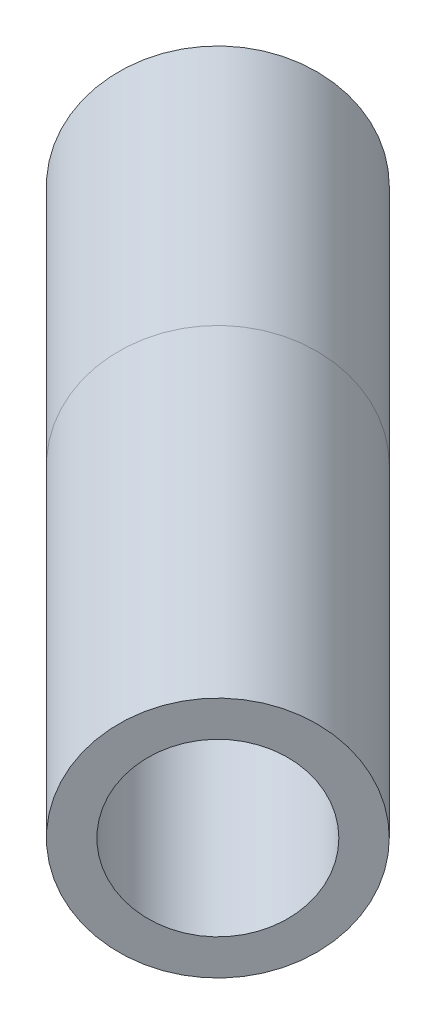
ISO-10303-21;
HEADER;
FILE_DESCRIPTION(('STEP AP214'),'2;1');
FILE_NAME('part.step','',(''),(''),'','','');
FILE_SCHEMA(('AUTOMOTIVE_DESIGN { 1 0 10303 214 1 1 1 1 }'));
ENDSEC;
DATA;
#1=APPLICATION_CONTEXT('core data for automotive mechanical design processes');
#2=APPLICATION_PROTOCOL_DEFINITION('international standard','automotive_design',2000,#1);
#3=PRODUCT_CONTEXT('',#1,'mechanical');
#4=PRODUCT('Part','Part','',(#3));
#5=PRODUCT_RELATED_PRODUCT_CATEGORY('part','',(#4));
#6=PRODUCT_DEFINITION_FORMATION('','',#4);
#7=PRODUCT_DEFINITION_CONTEXT('part definition',#1,'design');
#8=PRODUCT_DEFINITION('design','',#6,#7);
#9=PRODUCT_DEFINITION_SHAPE('','',#8);
#10=(LENGTH_UNIT() NAMED_UNIT(*) SI_UNIT(.MILLI.,.METRE.));
#11=(NAMED_UNIT(*) PLANE_ANGLE_UNIT() SI_UNIT($,.RADIAN.));
#12=(NAMED_UNIT(*) SI_UNIT($,.STERADIAN.) SOLID_ANGLE_UNIT());
#13=UNCERTAINTY_MEASURE_WITH_UNIT(LENGTH_MEASURE(1.E-05),#10,'distance_accuracy_value','');
#14=(GEOMETRIC_REPRESENTATION_CONTEXT(3) GLOBAL_UNCERTAINTY_ASSIGNED_CONTEXT((#13)) GLOBAL_UNIT_ASSIGNED_CONTEXT((#10,
#11,#12)) REPRESENTATION_CONTEXT('',''));
#15=CARTESIAN_POINT('',(0.,0.,0.));
#16=DIRECTION('',(0.,0.,1.));
#17=DIRECTION('',(1.,0.,0.));
#18=AXIS2_PLACEMENT_3D('',#15,#16,#17);
#19=CARTESIAN_POINT('',(0.,0.,0.));
#20=DIRECTION('',(0.707106781186548,0.,0.707106781186547));
#21=DIRECTION('',(0.707106781186547,0.,-0.707106781186548));
#22=AXIS2_PLACEMENT_3D('',#19,#20,#21);
#23=PLANE('',#22);
#24=CARTESIAN_POINT('',(0.,0.,0.));
#25=DIRECTION('',(0.707106781186548,0.,0.707106781186547));
#26=DIRECTION('',(0.707106781186547,0.,-0.707106781186548));
#27=AXIS2_PLACEMENT_3D('',#24,#25,#26);
#28=CIRCLE('',#27,9.525);
#29=CARTESIAN_POINT('',(6.73519209080187,0.,-6.73519209080188));
#30=VERTEX_POINT('',#29);
#31=EDGE_CURVE('E71',#30,#30,#28,.T.);
#32=ORIENTED_EDGE('',*,*,#31,.F.);
#33=EDGE_LOOP('',(#32));
#34=FACE_BOUND('',#33,.T.);
#35=CARTESIAN_POINT('',(0.,0.,0.));
#36=DIRECTION('',(0.707106781186548,0.,0.707106781186547));
#37=DIRECTION('',(0.707106781186547,0.,-0.707106781186548));
#38=AXIS2_PLACEMENT_3D('',#35,#36,#37);
#39=CIRCLE('',#38,13.49375);
#40=CARTESIAN_POINT('',(9.54152212863597,0.,-9.54152212863599));
#41=VERTEX_POINT('',#40);
#42=EDGE_CURVE('E67',#41,#41,#39,.T.);
#43=ORIENTED_EDGE('',*,*,#42,.T.);
#44=EDGE_LOOP('',(#43));
#45=FACE_BOUND('',#44,.T.);
#46=ADVANCED_FACE('F57',(#34,#45),#23,.T.);
#47=CARTESIAN_POINT('',(-62.8617928474841,0.,-62.8617928474841));
#48=DIRECTION('',(0.707106781186548,0.,0.707106781186547));
#49=DIRECTION('',(0.707106781186547,0.,-0.707106781186548));
#50=AXIS2_PLACEMENT_3D('',#47,#48,#49);
#51=PLANE('',#50);
#52=CARTESIAN_POINT('',(-62.8617928474841,0.,-62.8617928474841));
#53=DIRECTION('',(0.707106781186548,0.,0.707106781186547));
#54=DIRECTION('',(0.707106781186547,0.,-0.707106781186548));
#55=AXIS2_PLACEMENT_3D('',#52,#53,#54);
#56=CIRCLE('',#55,9.525);
#57=CARTESIAN_POINT('',(-56.1266007566822,0.,-69.5969849382859));
#58=VERTEX_POINT('',#57);
#59=EDGE_CURVE('E76',#58,#58,#56,.T.);
#60=ORIENTED_EDGE('',*,*,#59,.T.);
#61=EDGE_LOOP('',(#60));
#62=FACE_BOUND('',#61,.T.);
#63=CARTESIAN_POINT('',(-62.8617928474841,0.,-62.8617928474841));
#64=DIRECTION('',(0.707106781186548,0.,0.707106781186547));
#65=DIRECTION('',(0.707106781186547,0.,-0.707106781186548));
#66=AXIS2_PLACEMENT_3D('',#63,#64,#65);
#67=CIRCLE('',#66,13.49375);
#68=CARTESIAN_POINT('',(-53.3202707188481,0.,-72.40331497612));
#69=VERTEX_POINT('',#68);
#70=EDGE_CURVE('E11',#69,#69,#67,.T.);
#71=ORIENTED_EDGE('',*,*,#70,.F.);
#72=EDGE_LOOP('',(#71));
#73=FACE_BOUND('',#72,.T.);
#74=ADVANCED_FACE('F83',(#62,#73),#51,.F.);
#75=CARTESIAN_POINT('',(0.,0.,0.));
#76=DIRECTION('',(-0.707106781186548,0.,-0.707106781186548));
#77=DIRECTION('',(-0.707106781186548,0.,0.707106781186548));
#78=AXIS2_PLACEMENT_3D('',#75,#76,#77);
#79=CYLINDRICAL_SURFACE('',#78,13.49375);
#80=CARTESIAN_POINT('',(-35.9210244842766,0.,-35.9210244842766));
#81=DIRECTION('',(0.707106781186548,0.,0.707106781186547));
#82=DIRECTION('',(0.707106781186547,0.,-0.707106781186548));
#83=AXIS2_PLACEMENT_3D('',#80,#81,#82);
#84=CIRCLE('',#83,13.49375);
#85=CARTESIAN_POINT('',(-26.3795023556406,0.,-45.4625466129126));
#86=VERTEX_POINT('',#85);
#87=EDGE_CURVE('E63',#86,#86,#84,.T.);
#88=ORIENTED_EDGE('',*,*,#87,.T.);
#89=EDGE_LOOP('',(#88));
#90=FACE_BOUND('',#89,.T.);
#91=ORIENTED_EDGE('',*,*,#42,.F.);
#92=EDGE_LOOP('',(#91));
#93=FACE_BOUND('',#92,.T.);
#94=ADVANCED_FACE('F103',(#90,#93),#79,.T.);
#95=CARTESIAN_POINT('',(-35.9210244842766,0.,-35.9210244842766));
#96=DIRECTION('',(-0.707106781186547,0.,-0.707106781186547));
#97=DIRECTION('',(-0.707106781186548,0.,0.707106781186548));
#98=AXIS2_PLACEMENT_3D('',#95,#96,#97);
#99=CYLINDRICAL_SURFACE('',#98,13.49375);
#100=ORIENTED_EDGE('',*,*,#70,.T.);
#101=EDGE_LOOP('',(#100));
#102=FACE_BOUND('',#101,.T.);
#103=ORIENTED_EDGE('',*,*,#87,.F.);
#104=EDGE_LOOP('',(#103));
#105=FACE_BOUND('',#104,.T.);
#106=ADVANCED_FACE('F95',(#102,#105),#99,.T.);
#107=CARTESIAN_POINT('',(3.53553390593274,0.,3.53553390593273));
#108=DIRECTION('',(-0.707106781186548,0.,-0.707106781186548));
#109=DIRECTION('',(-0.707106781186548,0.,0.707106781186548));
#110=AXIS2_PLACEMENT_3D('',#107,#108,#109);
#111=CYLINDRICAL_SURFACE('',#110,9.525);
#112=CARTESIAN_POINT('',(-35.9210244842766,0.,-35.9210244842766));
#113=DIRECTION('',(0.707106781186548,0.,0.707106781186547));
#114=DIRECTION('',(0.707106781186547,0.,-0.707106781186548));
#115=AXIS2_PLACEMENT_3D('',#112,#113,#114);
#116=CIRCLE('',#115,9.525);
#117=CARTESIAN_POINT('',(-29.1858323934747,0.,-42.6562165750785));
#118=VERTEX_POINT('',#117);
#119=EDGE_CURVE('E77',#118,#118,#116,.T.);
#120=ORIENTED_EDGE('',*,*,#119,.F.);
#121=EDGE_LOOP('',(#120));
#122=FACE_BOUND('',#121,.T.);
#123=ORIENTED_EDGE('',*,*,#31,.T.);
#124=EDGE_LOOP('',(#123));
#125=FACE_BOUND('',#124,.T.);
#126=ADVANCED_FACE('F89',(#122,#125),#111,.F.);
#127=CARTESIAN_POINT('',(-35.9210244842766,0.,-35.9210244842766));
#128=DIRECTION('',(-0.707106781186548,0.,-0.707106781186548));
#129=DIRECTION('',(-0.707106781186548,0.,0.707106781186548));
#130=AXIS2_PLACEMENT_3D('',#127,#128,#129);
#131=CYLINDRICAL_SURFACE('',#130,9.525);
#132=ORIENTED_EDGE('',*,*,#59,.F.);
#133=EDGE_LOOP('',(#132));
#134=FACE_BOUND('',#133,.T.);
#135=ORIENTED_EDGE('',*,*,#119,.T.);
#136=EDGE_LOOP('',(#135));
#137=FACE_BOUND('',#136,.T.);
#138=ADVANCED_FACE('F86',(#134,#137),#131,.F.);
#139=CLOSED_SHELL('',(#46,#74,#94,#106,#126,#138));
#140=MANIFOLD_SOLID_BREP('B2',#139);
#141=ADVANCED_BREP_SHAPE_REPRESENTATION('',(#18,#140),#14);
#142=SHAPE_DEFINITION_REPRESENTATION(#9,#141);
ENDSEC;
END-ISO-10303-21;
